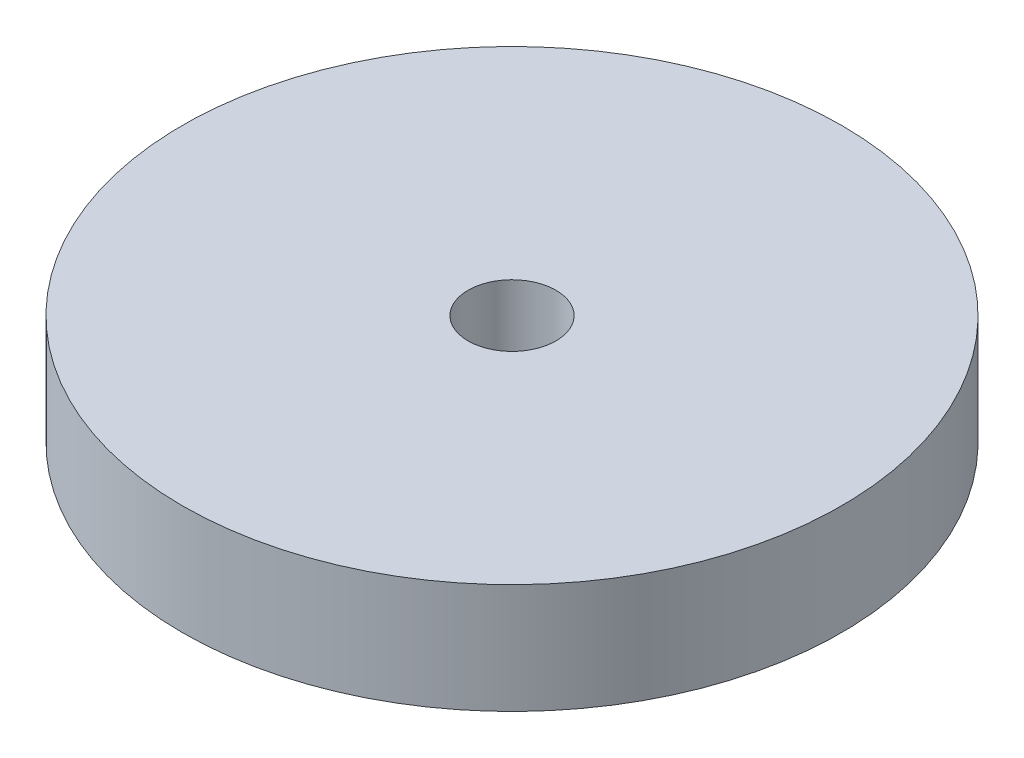
ISO-10303-21;
HEADER;
FILE_DESCRIPTION(('STEP AP214'),'2;1');
FILE_NAME('part.step','',(''),(''),'','','');
FILE_SCHEMA(('AUTOMOTIVE_DESIGN { 1 0 10303 214 1 1 1 1 }'));
ENDSEC;
DATA;
#1=APPLICATION_CONTEXT('core data for automotive mechanical design processes');
#2=APPLICATION_PROTOCOL_DEFINITION('international standard','automotive_design',2000,#1);
#3=PRODUCT_CONTEXT('',#1,'mechanical');
#4=PRODUCT('Part','Part','',(#3));
#5=PRODUCT_RELATED_PRODUCT_CATEGORY('part','',(#4));
#6=PRODUCT_DEFINITION_FORMATION('','',#4);
#7=PRODUCT_DEFINITION_CONTEXT('part definition',#1,'design');
#8=PRODUCT_DEFINITION('design','',#6,#7);
#9=PRODUCT_DEFINITION_SHAPE('','',#8);
#10=(LENGTH_UNIT() NAMED_UNIT(*) SI_UNIT(.MILLI.,.METRE.));
#11=(NAMED_UNIT(*) PLANE_ANGLE_UNIT() SI_UNIT($,.RADIAN.));
#12=(NAMED_UNIT(*) SI_UNIT($,.STERADIAN.) SOLID_ANGLE_UNIT());
#13=UNCERTAINTY_MEASURE_WITH_UNIT(LENGTH_MEASURE(1.E-05),#10,'distance_accuracy_value','');
#14=(GEOMETRIC_REPRESENTATION_CONTEXT(3) GLOBAL_UNCERTAINTY_ASSIGNED_CONTEXT((#13)) GLOBAL_UNIT_ASSIGNED_CONTEXT((#10,
#11,#12)) REPRESENTATION_CONTEXT('',''));
#15=CARTESIAN_POINT('',(0.,0.,0.));
#16=DIRECTION('',(0.,0.,1.));
#17=DIRECTION('',(1.,0.,0.));
#18=AXIS2_PLACEMENT_3D('',#15,#16,#17);
#19=CARTESIAN_POINT('',(0.,5.,0.));
#20=DIRECTION('',(0.,1.,0.));
#21=DIRECTION('',(0.,0.,1.));
#22=AXIS2_PLACEMENT_3D('',#19,#20,#21);
#23=PLANE('',#22);
#24=CARTESIAN_POINT('',(0.,5.,0.));
#25=DIRECTION('',(0.,1.,0.));
#26=DIRECTION('',(0.,0.,1.));
#27=AXIS2_PLACEMENT_3D('',#24,#25,#26);
#28=CIRCLE('',#27,15.);
#29=CARTESIAN_POINT('',(0.,5.,15.));
#30=VERTEX_POINT('',#29);
#31=EDGE_CURVE('E10',#30,#30,#28,.T.);
#32=ORIENTED_EDGE('',*,*,#31,.T.);
#33=EDGE_LOOP('',(#32));
#34=FACE_BOUND('',#33,.T.);
#35=CARTESIAN_POINT('',(0.,5.,0.));
#36=DIRECTION('',(0.,1.,0.));
#37=DIRECTION('',(0.,0.,1.));
#38=AXIS2_PLACEMENT_3D('',#35,#36,#37);
#39=CIRCLE('',#38,2.);
#40=CARTESIAN_POINT('',(0.,5.,2.));
#41=VERTEX_POINT('',#40);
#42=EDGE_CURVE('E50',#41,#41,#39,.T.);
#43=ORIENTED_EDGE('',*,*,#42,.F.);
#44=EDGE_LOOP('',(#43));
#45=FACE_BOUND('',#44,.T.);
#46=ADVANCED_FACE('F39',(#34,#45),#23,.T.);
#47=CARTESIAN_POINT('',(0.,0.,0.));
#48=DIRECTION('',(0.,1.,0.));
#49=DIRECTION('',(0.,0.,1.));
#50=AXIS2_PLACEMENT_3D('',#47,#48,#49);
#51=PLANE('',#50);
#52=CARTESIAN_POINT('',(0.,0.,0.));
#53=DIRECTION('',(0.,1.,0.));
#54=DIRECTION('',(0.,0.,1.));
#55=AXIS2_PLACEMENT_3D('',#52,#53,#54);
#56=CIRCLE('',#55,15.);
#57=CARTESIAN_POINT('',(0.,0.,15.));
#58=VERTEX_POINT('',#57);
#59=EDGE_CURVE('E43',#58,#58,#56,.T.);
#60=ORIENTED_EDGE('',*,*,#59,.F.);
#61=EDGE_LOOP('',(#60));
#62=FACE_BOUND('',#61,.T.);
#63=CARTESIAN_POINT('',(0.,0.,0.));
#64=DIRECTION('',(0.,1.,0.));
#65=DIRECTION('',(0.,0.,1.));
#66=AXIS2_PLACEMENT_3D('',#63,#64,#65);
#67=CIRCLE('',#66,2.);
#68=CARTESIAN_POINT('',(0.,0.,2.));
#69=VERTEX_POINT('',#68);
#70=EDGE_CURVE('E52',#69,#69,#67,.T.);
#71=ORIENTED_EDGE('',*,*,#70,.T.);
#72=EDGE_LOOP('',(#71));
#73=FACE_BOUND('',#72,.T.);
#74=ADVANCED_FACE('F62',(#62,#73),#51,.F.);
#75=CARTESIAN_POINT('',(0.,5.,0.));
#76=DIRECTION('',(0.,-1.,0.));
#77=DIRECTION('',(0.,0.,-1.));
#78=AXIS2_PLACEMENT_3D('',#75,#76,#77);
#79=CYLINDRICAL_SURFACE('',#78,15.);
#80=ORIENTED_EDGE('',*,*,#31,.F.);
#81=EDGE_LOOP('',(#80));
#82=FACE_BOUND('',#81,.T.);
#83=ORIENTED_EDGE('',*,*,#59,.T.);
#84=EDGE_LOOP('',(#83));
#85=FACE_BOUND('',#84,.T.);
#86=ADVANCED_FACE('F41',(#82,#85),#79,.T.);
#87=CARTESIAN_POINT('',(0.,5.,0.));
#88=DIRECTION('',(0.,-1.,0.));
#89=DIRECTION('',(0.,0.,-1.));
#90=AXIS2_PLACEMENT_3D('',#87,#88,#89);
#91=CYLINDRICAL_SURFACE('',#90,2.);
#92=ORIENTED_EDGE('',*,*,#42,.T.);
#93=EDGE_LOOP('',(#92));
#94=FACE_BOUND('',#93,.T.);
#95=ORIENTED_EDGE('',*,*,#70,.F.);
#96=EDGE_LOOP('',(#95));
#97=FACE_BOUND('',#96,.T.);
#98=ADVANCED_FACE('F58',(#94,#97),#91,.F.);
#99=CLOSED_SHELL('',(#46,#74,#86,#98));
#100=MANIFOLD_SOLID_BREP('B2',#99);
#101=ADVANCED_BREP_SHAPE_REPRESENTATION('',(#18,#100),#14);
#102=SHAPE_DEFINITION_REPRESENTATION(#9,#101);
ENDSEC;
END-ISO-10303-21;
